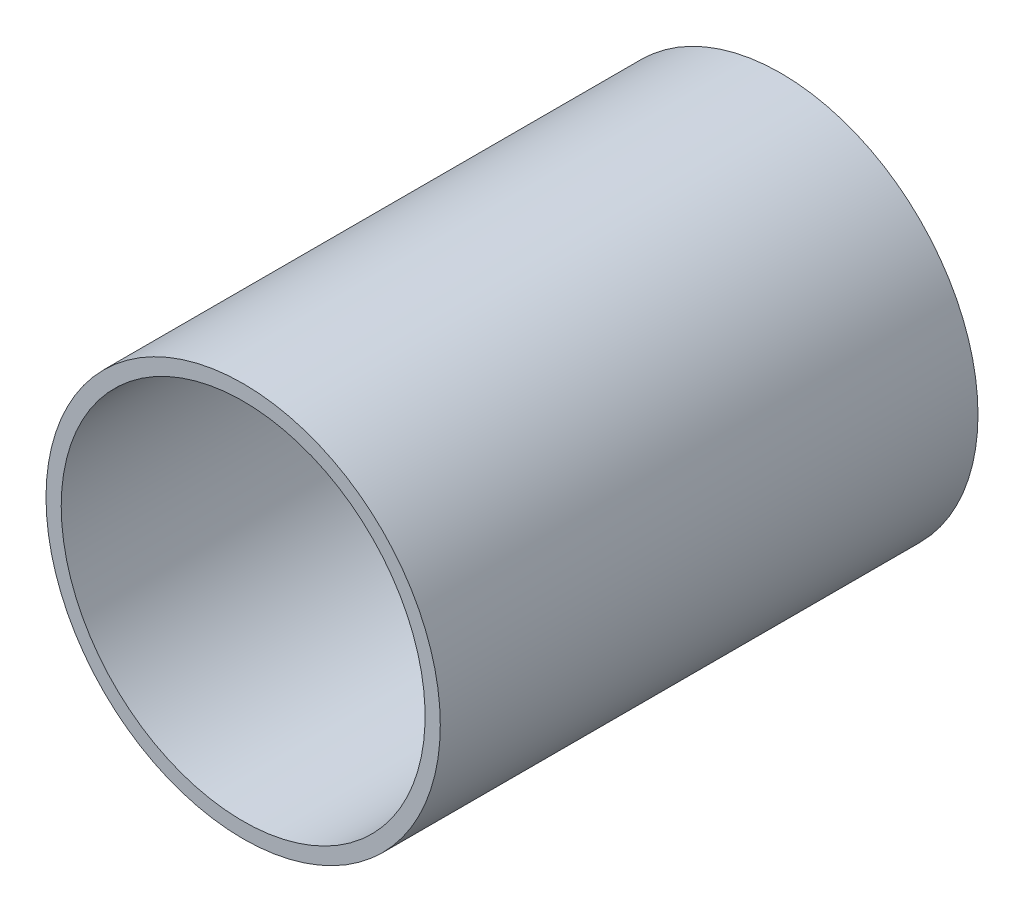
ISO-10303-21;
HEADER;
FILE_DESCRIPTION(('STEP AP214'),'2;1');
FILE_NAME('part.step','',(''),(''),'','','');
FILE_SCHEMA(('AUTOMOTIVE_DESIGN { 1 0 10303 214 1 1 1 1 }'));
ENDSEC;
DATA;
#1=APPLICATION_CONTEXT('core data for automotive mechanical design processes');
#2=APPLICATION_PROTOCOL_DEFINITION('international standard','automotive_design',2000,#1);
#3=PRODUCT_CONTEXT('',#1,'mechanical');
#4=PRODUCT('Part','Part','',(#3));
#5=PRODUCT_RELATED_PRODUCT_CATEGORY('part','',(#4));
#6=PRODUCT_DEFINITION_FORMATION('','',#4);
#7=PRODUCT_DEFINITION_CONTEXT('part definition',#1,'design');
#8=PRODUCT_DEFINITION('design','',#6,#7);
#9=PRODUCT_DEFINITION_SHAPE('','',#8);
#10=(LENGTH_UNIT() NAMED_UNIT(*) SI_UNIT(.MILLI.,.METRE.));
#11=(NAMED_UNIT(*) PLANE_ANGLE_UNIT() SI_UNIT($,.RADIAN.));
#12=(NAMED_UNIT(*) SI_UNIT($,.STERADIAN.) SOLID_ANGLE_UNIT());
#13=UNCERTAINTY_MEASURE_WITH_UNIT(LENGTH_MEASURE(1.E-05),#10,'distance_accuracy_value','');
#14=(GEOMETRIC_REPRESENTATION_CONTEXT(3) GLOBAL_UNCERTAINTY_ASSIGNED_CONTEXT((#13)) GLOBAL_UNIT_ASSIGNED_CONTEXT((#10,
#11,#12)) REPRESENTATION_CONTEXT('',''));
#15=CARTESIAN_POINT('',(0.,0.,0.));
#16=DIRECTION('',(0.,0.,1.));
#17=DIRECTION('',(1.,0.,0.));
#18=AXIS2_PLACEMENT_3D('',#15,#16,#17);
#19=CARTESIAN_POINT('',(0.,0.,90.));
#20=DIRECTION('',(0.,0.,-1.));
#21=DIRECTION('',(-1.,0.,0.));
#22=AXIS2_PLACEMENT_3D('',#19,#20,#21);
#23=CYLINDRICAL_SURFACE('',#22,33.);
#24=CARTESIAN_POINT('',(0.,0.,90.));
#25=DIRECTION('',(0.,0.,1.));
#26=DIRECTION('',(1.,0.,0.));
#27=AXIS2_PLACEMENT_3D('',#24,#25,#26);
#28=CIRCLE('',#27,33.);
#29=CARTESIAN_POINT('',(-33.,0.,90.));
#30=VERTEX_POINT('',#29);
#31=EDGE_CURVE('E10',#30,#30,#28,.T.);
#32=CARTESIAN_POINT('',(0.,0.,0.));
#33=DIRECTION('',(0.,0.,1.));
#34=DIRECTION('',(1.,0.,0.));
#35=AXIS2_PLACEMENT_3D('',#32,#33,#34);
#36=CIRCLE('',#35,33.);
#37=CARTESIAN_POINT('',(-33.,0.,0.));
#38=VERTEX_POINT('',#37);
#39=EDGE_CURVE('E38',#38,#38,#36,.T.);
#40=CARTESIAN_POINT('',(-33.,0.,90.));
#41=CARTESIAN_POINT('',(-33.,0.,89.0625));
#42=CARTESIAN_POINT('',(-33.,0.,88.125));
#43=CARTESIAN_POINT('',(-33.,0.,86.25));
#44=CARTESIAN_POINT('',(-33.,0.,85.3125));
#45=CARTESIAN_POINT('',(-33.,0.,83.4375));
#46=CARTESIAN_POINT('',(-33.,0.,82.5));
#47=CARTESIAN_POINT('',(-33.,0.,80.625));
#48=CARTESIAN_POINT('',(-33.,0.,79.6875));
#49=CARTESIAN_POINT('',(-33.,0.,77.8125));
#50=CARTESIAN_POINT('',(-33.,0.,76.875));
#51=CARTESIAN_POINT('',(-33.,0.,75.));
#52=CARTESIAN_POINT('',(-33.,0.,74.0625));
#53=CARTESIAN_POINT('',(-33.,0.,72.1875));
#54=CARTESIAN_POINT('',(-33.,0.,71.25));
#55=CARTESIAN_POINT('',(-33.,0.,69.375));
#56=CARTESIAN_POINT('',(-33.,0.,68.4375));
#57=CARTESIAN_POINT('',(-33.,0.,66.5625));
#58=CARTESIAN_POINT('',(-33.,0.,65.625));
#59=CARTESIAN_POINT('',(-33.,0.,63.75));
#60=CARTESIAN_POINT('',(-33.,0.,62.8125));
#61=CARTESIAN_POINT('',(-33.,0.,60.9375));
#62=CARTESIAN_POINT('',(-33.,0.,60.));
#63=CARTESIAN_POINT('',(-33.,0.,58.125));
#64=CARTESIAN_POINT('',(-33.,0.,57.1875));
#65=CARTESIAN_POINT('',(-33.,0.,55.3125));
#66=CARTESIAN_POINT('',(-33.,0.,54.375));
#67=CARTESIAN_POINT('',(-33.,0.,52.5));
#68=CARTESIAN_POINT('',(-33.,0.,51.5625));
#69=CARTESIAN_POINT('',(-33.,0.,49.6875));
#70=CARTESIAN_POINT('',(-33.,0.,48.75));
#71=CARTESIAN_POINT('',(-33.,0.,46.875));
#72=CARTESIAN_POINT('',(-33.,0.,45.9375));
#73=CARTESIAN_POINT('',(-33.,0.,44.0625));
#74=CARTESIAN_POINT('',(-33.,0.,43.125));
#75=CARTESIAN_POINT('',(-33.,0.,41.25));
#76=CARTESIAN_POINT('',(-33.,0.,40.3125));
#77=CARTESIAN_POINT('',(-33.,0.,38.4375));
#78=CARTESIAN_POINT('',(-33.,0.,37.5));
#79=CARTESIAN_POINT('',(-33.,0.,35.625));
#80=CARTESIAN_POINT('',(-33.,0.,34.6875));
#81=CARTESIAN_POINT('',(-33.,0.,32.8125));
#82=CARTESIAN_POINT('',(-33.,0.,31.875));
#83=CARTESIAN_POINT('',(-33.,0.,30.));
#84=CARTESIAN_POINT('',(-33.,0.,29.0625));
#85=CARTESIAN_POINT('',(-33.,0.,27.1875));
#86=CARTESIAN_POINT('',(-33.,0.,26.25));
#87=CARTESIAN_POINT('',(-33.,0.,24.375));
#88=CARTESIAN_POINT('',(-33.,0.,23.4375));
#89=CARTESIAN_POINT('',(-33.,0.,21.5625));
#90=CARTESIAN_POINT('',(-33.,0.,20.625));
#91=CARTESIAN_POINT('',(-33.,0.,18.75));
#92=CARTESIAN_POINT('',(-33.,0.,17.8125));
#93=CARTESIAN_POINT('',(-33.,0.,15.9375));
#94=CARTESIAN_POINT('',(-33.,0.,15.));
#95=CARTESIAN_POINT('',(-33.,0.,13.125));
#96=CARTESIAN_POINT('',(-33.,0.,12.1875));
#97=CARTESIAN_POINT('',(-33.,0.,10.3125));
#98=CARTESIAN_POINT('',(-33.,0.,9.37499999999999));
#99=CARTESIAN_POINT('',(-33.,0.,7.49999999999999));
#100=CARTESIAN_POINT('',(-33.,0.,6.56249999999999));
#101=CARTESIAN_POINT('',(-33.,0.,4.68749999999999));
#102=CARTESIAN_POINT('',(-33.,0.,3.74999999999998));
#103=CARTESIAN_POINT('',(-33.,0.,1.87499999999998));
#104=CARTESIAN_POINT('',(-33.,0.,0.937499999999986));
#105=CARTESIAN_POINT('',(-33.,0.,0.));
#106=B_SPLINE_CURVE_WITH_KNOTS('',3,(#40,#41,#42,#43,#44,#45,#46,#47,#48,#49,#50,#51,#52,#53,
#54,#55,#56,#57,#58,#59,#60,#61,#62,#63,#64,#65,#66,#67,#68,#69,#70,#71,#72,#73,#74,#75,#76,#77,
#78,#79,#80,#81,#82,#83,#84,#85,#86,#87,#88,#89,#90,#91,#92,#93,#94,#95,#96,#97,#98,#99,#100,
#101,#102,#103,#104,#105),.UNSPECIFIED.,.F.,.F.,(4,2,2,2,2,2,2,2,2,2,2,2,2,2,2,2,2,2,2,2,2,2,2,
2,2,2,2,2,2,2,2,2,4),(0.,2.81250000000001,5.62500000000001,8.43750000000001,11.25,14.0625,
16.875,19.6875,22.5,25.3125,28.125,30.9375,33.75,36.5625,39.375,42.1875,45.,47.8125,50.625,
53.4375,56.25,59.0625,61.875,64.6875,67.5,70.3125,73.125,75.9375,78.75,81.5625,84.375,87.1875,
90.),.UNSPECIFIED.);
#107=EDGE_CURVE('BSEAM35',#30,#38,#106,.T.);
#108=ORIENTED_EDGE('',*,*,#31,.F.);
#109=ORIENTED_EDGE('',*,*,#39,.T.);
#110=ORIENTED_EDGE('',*,*,#107,.T.);
#111=ORIENTED_EDGE('',*,*,#107,.F.);
#112=EDGE_LOOP('',(#108,#110,#109,#111));
#113=FACE_BOUND('',#112,.T.);
#114=ADVANCED_FACE('F35',(#113),#23,.T.);
#115=CARTESIAN_POINT('',(0.,0.,90.));
#116=DIRECTION('',(0.,0.,1.));
#117=DIRECTION('',(1.,0.,0.));
#118=AXIS2_PLACEMENT_3D('',#115,#116,#117);
#119=PLANE('',#118);
#120=CARTESIAN_POINT('',(0.,0.,90.));
#121=DIRECTION('',(0.,0.,-1.));
#122=DIRECTION('',(-1.,0.,0.));
#123=AXIS2_PLACEMENT_3D('',#120,#121,#122);
#124=CIRCLE('',#123,30.4546);
#125=CARTESIAN_POINT('',(-30.4546,0.,90.));
#126=VERTEX_POINT('',#125);
#127=EDGE_CURVE('E45',#126,#126,#124,.T.);
#128=ORIENTED_EDGE('',*,*,#127,.T.);
#129=EDGE_LOOP('',(#128));
#130=FACE_BOUND('',#129,.T.);
#131=ORIENTED_EDGE('',*,*,#31,.T.);
#132=EDGE_LOOP('',(#131));
#133=FACE_BOUND('',#132,.T.);
#134=ADVANCED_FACE('F53',(#130,#133),#119,.T.);
#135=CARTESIAN_POINT('',(0.,0.,0.));
#136=DIRECTION('',(0.,0.,1.));
#137=DIRECTION('',(1.,0.,0.));
#138=AXIS2_PLACEMENT_3D('',#135,#136,#137);
#139=PLANE('',#138);
#140=CARTESIAN_POINT('',(0.,0.,0.));
#141=DIRECTION('',(0.,0.,-1.));
#142=DIRECTION('',(-1.,0.,0.));
#143=AXIS2_PLACEMENT_3D('',#140,#141,#142);
#144=CIRCLE('',#143,30.4546);
#145=CARTESIAN_POINT('',(-30.4546,0.,0.));
#146=VERTEX_POINT('',#145);
#147=EDGE_CURVE('E47',#146,#146,#144,.T.);
#148=ORIENTED_EDGE('',*,*,#147,.F.);
#149=EDGE_LOOP('',(#148));
#150=FACE_BOUND('',#149,.T.);
#151=ORIENTED_EDGE('',*,*,#39,.F.);
#152=EDGE_LOOP('',(#151));
#153=FACE_BOUND('',#152,.T.);
#154=ADVANCED_FACE('F58',(#150,#153),#139,.F.);
#155=CARTESIAN_POINT('',(0.,0.,90.));
#156=DIRECTION('',(0.,0.,-1.));
#157=DIRECTION('',(-1.,0.,0.));
#158=AXIS2_PLACEMENT_3D('',#155,#156,#157);
#159=CYLINDRICAL_SURFACE('',#158,30.4546);
#160=CARTESIAN_POINT('',(-30.4546,0.,90.));
#161=CARTESIAN_POINT('',(-30.4546,0.,89.0625));
#162=CARTESIAN_POINT('',(-30.4546,0.,88.125));
#163=CARTESIAN_POINT('',(-30.4546,0.,86.25));
#164=CARTESIAN_POINT('',(-30.4546,0.,85.3125));
#165=CARTESIAN_POINT('',(-30.4546,0.,83.4375));
#166=CARTESIAN_POINT('',(-30.4546,0.,82.5));
#167=CARTESIAN_POINT('',(-30.4546,0.,80.625));
#168=CARTESIAN_POINT('',(-30.4546,0.,79.6875));
#169=CARTESIAN_POINT('',(-30.4546,0.,77.8125));
#170=CARTESIAN_POINT('',(-30.4546,0.,76.875));
#171=CARTESIAN_POINT('',(-30.4546,0.,75.));
#172=CARTESIAN_POINT('',(-30.4546,0.,74.0625));
#173=CARTESIAN_POINT('',(-30.4546,0.,72.1875));
#174=CARTESIAN_POINT('',(-30.4546,0.,71.25));
#175=CARTESIAN_POINT('',(-30.4546,0.,69.375));
#176=CARTESIAN_POINT('',(-30.4546,0.,68.4375));
#177=CARTESIAN_POINT('',(-30.4546,0.,66.5625));
#178=CARTESIAN_POINT('',(-30.4546,0.,65.625));
#179=CARTESIAN_POINT('',(-30.4546,0.,63.75));
#180=CARTESIAN_POINT('',(-30.4546,0.,62.8125));
#181=CARTESIAN_POINT('',(-30.4546,0.,60.9375));
#182=CARTESIAN_POINT('',(-30.4546,0.,60.));
#183=CARTESIAN_POINT('',(-30.4546,0.,58.125));
#184=CARTESIAN_POINT('',(-30.4546,0.,57.1875));
#185=CARTESIAN_POINT('',(-30.4546,0.,55.3125));
#186=CARTESIAN_POINT('',(-30.4546,0.,54.375));
#187=CARTESIAN_POINT('',(-30.4546,0.,52.5));
#188=CARTESIAN_POINT('',(-30.4546,0.,51.5625));
#189=CARTESIAN_POINT('',(-30.4546,0.,49.6875));
#190=CARTESIAN_POINT('',(-30.4546,0.,48.75));
#191=CARTESIAN_POINT('',(-30.4546,0.,46.875));
#192=CARTESIAN_POINT('',(-30.4546,0.,45.9375));
#193=CARTESIAN_POINT('',(-30.4546,0.,44.0625));
#194=CARTESIAN_POINT('',(-30.4546,0.,43.125));
#195=CARTESIAN_POINT('',(-30.4546,0.,41.25));
#196=CARTESIAN_POINT('',(-30.4546,0.,40.3125));
#197=CARTESIAN_POINT('',(-30.4546,0.,38.4375));
#198=CARTESIAN_POINT('',(-30.4546,0.,37.5));
#199=CARTESIAN_POINT('',(-30.4546,0.,35.625));
#200=CARTESIAN_POINT('',(-30.4546,0.,34.6875));
#201=CARTESIAN_POINT('',(-30.4546,0.,32.8125));
#202=CARTESIAN_POINT('',(-30.4546,0.,31.875));
#203=CARTESIAN_POINT('',(-30.4546,0.,30.));
#204=CARTESIAN_POINT('',(-30.4546,0.,29.0625));
#205=CARTESIAN_POINT('',(-30.4546,0.,27.1875));
#206=CARTESIAN_POINT('',(-30.4546,0.,26.25));
#207=CARTESIAN_POINT('',(-30.4546,0.,24.375));
#208=CARTESIAN_POINT('',(-30.4546,0.,23.4375));
#209=CARTESIAN_POINT('',(-30.4546,0.,21.5625));
#210=CARTESIAN_POINT('',(-30.4546,0.,20.625));
#211=CARTESIAN_POINT('',(-30.4546,0.,18.75));
#212=CARTESIAN_POINT('',(-30.4546,0.,17.8125));
#213=CARTESIAN_POINT('',(-30.4546,0.,15.9375));
#214=CARTESIAN_POINT('',(-30.4546,0.,15.));
#215=CARTESIAN_POINT('',(-30.4546,0.,13.125));
#216=CARTESIAN_POINT('',(-30.4546,0.,12.1875));
#217=CARTESIAN_POINT('',(-30.4546,0.,10.3125));
#218=CARTESIAN_POINT('',(-30.4546,0.,9.37500000000001));
#219=CARTESIAN_POINT('',(-30.4546,0.,7.50000000000002));
#220=CARTESIAN_POINT('',(-30.4546,0.,6.56250000000002));
#221=CARTESIAN_POINT('',(-30.4546,0.,4.68750000000002));
#222=CARTESIAN_POINT('',(-30.4546,0.,3.75000000000001));
#223=CARTESIAN_POINT('',(-30.4546,0.,1.87500000000001));
#224=CARTESIAN_POINT('',(-30.4546,0.,0.937500000000014));
#225=CARTESIAN_POINT('',(-30.4546,0.,0.));
#226=B_SPLINE_CURVE_WITH_KNOTS('',3,(#160,#161,#162,#163,#164,#165,#166,#167,#168,#169,#170,
#171,#172,#173,#174,#175,#176,#177,#178,#179,#180,#181,#182,#183,#184,#185,#186,#187,#188,#189,
#190,#191,#192,#193,#194,#195,#196,#197,#198,#199,#200,#201,#202,#203,#204,#205,#206,#207,#208,
#209,#210,#211,#212,#213,#214,#215,#216,#217,#218,#219,#220,#221,#222,#223,#224,#225),
.UNSPECIFIED.,.F.,.F.,(4,2,2,2,2,2,2,2,2,2,2,2,2,2,2,2,2,2,2,2,2,2,2,2,2,2,2,2,2,2,2,2,4),(0.,
2.81250000000001,5.62500000000001,8.4375,11.25,14.0625,16.875,19.6875,22.5,25.3125,28.125,
30.9375,33.75,36.5625,39.375,42.1875,45.,47.8125,50.625,53.4375,56.25,59.0625,61.875,64.6875,
67.5,70.3125,73.125,75.9375,78.75,81.5625,84.375,87.1875,90.),.UNSPECIFIED.);
#227=EDGE_CURVE('BSEAM55',#126,#146,#226,.T.);
#228=ORIENTED_EDGE('',*,*,#127,.F.);
#229=ORIENTED_EDGE('',*,*,#147,.T.);
#230=ORIENTED_EDGE('',*,*,#227,.T.);
#231=ORIENTED_EDGE('',*,*,#227,.F.);
#232=EDGE_LOOP('',(#228,#230,#229,#231));
#233=FACE_BOUND('',#232,.T.);
#234=ADVANCED_FACE('F55',(#233),#159,.F.);
#235=CLOSED_SHELL('',(#114,#134,#154,#234));
#236=MANIFOLD_SOLID_BREP('B2',#235);
#237=ADVANCED_BREP_SHAPE_REPRESENTATION('',(#18,#236),#14);
#238=SHAPE_DEFINITION_REPRESENTATION(#9,#237);
ENDSEC;
END-ISO-10303-21;
